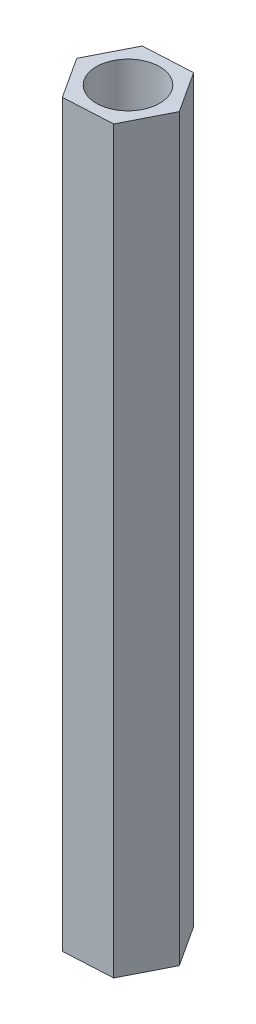
ISO-10303-21;
HEADER;
FILE_DESCRIPTION(('STEP AP214'),'2;1');
FILE_NAME('part.step','',(''),(''),'','','');
FILE_SCHEMA(('AUTOMOTIVE_DESIGN { 1 0 10303 214 1 1 1 1 }'));
ENDSEC;
DATA;
#1=APPLICATION_CONTEXT('core data for automotive mechanical design processes');
#2=APPLICATION_PROTOCOL_DEFINITION('international standard','automotive_design',2000,#1);
#3=PRODUCT_CONTEXT('',#1,'mechanical');
#4=PRODUCT('Part','Part','',(#3));
#5=PRODUCT_RELATED_PRODUCT_CATEGORY('part','',(#4));
#6=PRODUCT_DEFINITION_FORMATION('','',#4);
#7=PRODUCT_DEFINITION_CONTEXT('part definition',#1,'design');
#8=PRODUCT_DEFINITION('design','',#6,#7);
#9=PRODUCT_DEFINITION_SHAPE('','',#8);
#10=(LENGTH_UNIT() NAMED_UNIT(*) SI_UNIT(.MILLI.,.METRE.));
#11=(NAMED_UNIT(*) PLANE_ANGLE_UNIT() SI_UNIT($,.RADIAN.));
#12=(NAMED_UNIT(*) SI_UNIT($,.STERADIAN.) SOLID_ANGLE_UNIT());
#13=UNCERTAINTY_MEASURE_WITH_UNIT(LENGTH_MEASURE(1.E-05),#10,'distance_accuracy_value','');
#14=(GEOMETRIC_REPRESENTATION_CONTEXT(3) GLOBAL_UNCERTAINTY_ASSIGNED_CONTEXT((#13)) GLOBAL_UNIT_ASSIGNED_CONTEXT((#10,
#11,#12)) REPRESENTATION_CONTEXT('',''));
#15=CARTESIAN_POINT('',(0.,0.,0.));
#16=DIRECTION('',(0.,0.,1.));
#17=DIRECTION('',(1.,0.,0.));
#18=AXIS2_PLACEMENT_3D('',#15,#16,#17);
#19=CARTESIAN_POINT('',(0.,35.,0.));
#20=DIRECTION('',(0.,1.,0.));
#21=DIRECTION('',(0.,0.,1.));
#22=AXIS2_PLACEMENT_3D('',#19,#20,#21);
#23=PLANE('',#22);
#24=DIRECTION('',(-0.544928376691664,0.,-0.838482596287));
#25=VECTOR('',#24,1.);
#26=CARTESIAN_POINT('',(2.306194282518,35.,-0.121660448029098));
#27=LINE('',#26,#25);
#28=CARTESIAN_POINT('',(2.306194282518,35.,-0.121660448029098));
#29=VERTEX_POINT('',#28);
#30=CARTESIAN_POINT('',(1.04773610263,35.,-2.05805305873756));
#31=VERTEX_POINT('',#30);
#32=EDGE_CURVE('E131',#29,#31,#27,.T.);
#33=ORIENTED_EDGE('',*,*,#32,.T.);
#34=DIRECTION('',(-0.998611417361505,0.,0.0526805193144976));
#35=VECTOR('',#34,1.);
#36=CARTESIAN_POINT('',(1.04773610263,35.,-2.05805305873756));
#37=LINE('',#36,#35);
#38=CARTESIAN_POINT('',(-1.25845817988799,35.,-1.93639261070846));
#39=VERTEX_POINT('',#38);
#40=EDGE_CURVE('E89',#31,#39,#37,.T.);
#41=ORIENTED_EDGE('',*,*,#40,.T.);
#42=DIRECTION('',(-0.453683040669841,0.,0.891163115601497));
#43=VECTOR('',#42,1.);
#44=CARTESIAN_POINT('',(-1.25845817988799,35.,-1.93639261070846));
#45=LINE('',#44,#43);
#46=CARTESIAN_POINT('',(-2.30619428251799,35.,0.121660448029098));
#47=VERTEX_POINT('',#46);
#48=EDGE_CURVE('E102',#39,#47,#45,.T.);
#49=ORIENTED_EDGE('',*,*,#48,.T.);
#50=DIRECTION('',(0.544928376691665,0.,0.838482596286999));
#51=VECTOR('',#50,1.);
#52=CARTESIAN_POINT('',(-2.30619428251799,35.,0.121660448029098));
#53=LINE('',#52,#51);
#54=CARTESIAN_POINT('',(-1.04773610263,35.,2.05805305873756));
#55=VERTEX_POINT('',#54);
#56=EDGE_CURVE('E96',#47,#55,#53,.T.);
#57=ORIENTED_EDGE('',*,*,#56,.T.);
#58=DIRECTION('',(0.998611417361505,0.,-0.0526805193144977));
#59=VECTOR('',#58,1.);
#60=CARTESIAN_POINT('',(-1.04773610263,35.,2.05805305873756));
#61=LINE('',#60,#59);
#62=CARTESIAN_POINT('',(1.25845817988799,35.,1.93639261070846));
#63=VERTEX_POINT('',#62);
#64=EDGE_CURVE('E100',#55,#63,#61,.T.);
#65=ORIENTED_EDGE('',*,*,#64,.T.);
#66=DIRECTION('',(0.453683040669841,0.,-0.891163115601497));
#67=VECTOR('',#66,1.);
#68=CARTESIAN_POINT('',(1.25845817988799,35.,1.93639261070846));
#69=LINE('',#68,#67);
#70=EDGE_CURVE('E52',#63,#29,#69,.T.);
#71=ORIENTED_EDGE('',*,*,#70,.T.);
#72=EDGE_LOOP('',(#33,#41,#49,#57,#65,#71));
#73=FACE_BOUND('',#72,.T.);
#74=CARTESIAN_POINT('',(0.,35.,0.));
#75=DIRECTION('',(0.,1.,0.));
#76=DIRECTION('',(0.,0.,1.));
#77=AXIS2_PLACEMENT_3D('',#74,#75,#76);
#78=CIRCLE('',#77,1.5);
#79=CARTESIAN_POINT('',(0.,35.,1.5));
#80=VERTEX_POINT('',#79);
#81=EDGE_CURVE('E124',#80,#80,#78,.T.);
#82=ORIENTED_EDGE('',*,*,#81,.F.);
#83=EDGE_LOOP('',(#82));
#84=FACE_BOUND('',#83,.T.);
#85=ADVANCED_FACE('F35',(#73,#84),#23,.T.);
#86=CARTESIAN_POINT('',(0.,0.,0.));
#87=DIRECTION('',(0.,1.,0.));
#88=DIRECTION('',(0.,0.,1.));
#89=AXIS2_PLACEMENT_3D('',#86,#87,#88);
#90=PLANE('',#89);
#91=DIRECTION('',(-0.544928376691664,0.,-0.838482596287));
#92=VECTOR('',#91,1.);
#93=CARTESIAN_POINT('',(2.306194282518,0.,-0.121660448029098));
#94=LINE('',#93,#92);
#95=CARTESIAN_POINT('',(2.306194282518,0.,-0.121660448029098));
#96=VERTEX_POINT('',#95);
#97=CARTESIAN_POINT('',(1.04773610263,0.,-2.05805305873756));
#98=VERTEX_POINT('',#97);
#99=EDGE_CURVE('E120',#96,#98,#94,.T.);
#100=ORIENTED_EDGE('',*,*,#99,.F.);
#101=DIRECTION('',(0.453683040669841,0.,-0.891163115601497));
#102=VECTOR('',#101,1.);
#103=CARTESIAN_POINT('',(1.25845817988799,0.,1.93639261070846));
#104=LINE('',#103,#102);
#105=CARTESIAN_POINT('',(1.25845817988799,0.,1.93639261070846));
#106=VERTEX_POINT('',#105);
#107=EDGE_CURVE('E81',#106,#96,#104,.T.);
#108=ORIENTED_EDGE('',*,*,#107,.F.);
#109=DIRECTION('',(0.998611417361505,0.,-0.0526805193144977));
#110=VECTOR('',#109,1.);
#111=CARTESIAN_POINT('',(-1.04773610263,0.,2.05805305873756));
#112=LINE('',#111,#110);
#113=CARTESIAN_POINT('',(-1.04773610263,0.,2.05805305873756));
#114=VERTEX_POINT('',#113);
#115=EDGE_CURVE('E75',#114,#106,#112,.T.);
#116=ORIENTED_EDGE('',*,*,#115,.F.);
#117=DIRECTION('',(0.544928376691665,0.,0.838482596286999));
#118=VECTOR('',#117,1.);
#119=CARTESIAN_POINT('',(-2.30619428251799,0.,0.121660448029098));
#120=LINE('',#119,#118);
#121=CARTESIAN_POINT('',(-2.30619428251799,0.,0.121660448029098));
#122=VERTEX_POINT('',#121);
#123=EDGE_CURVE('E110',#122,#114,#120,.T.);
#124=ORIENTED_EDGE('',*,*,#123,.F.);
#125=DIRECTION('',(-0.453683040669841,0.,0.891163115601497));
#126=VECTOR('',#125,1.);
#127=CARTESIAN_POINT('',(-1.25845817988799,0.,-1.93639261070846));
#128=LINE('',#127,#126);
#129=CARTESIAN_POINT('',(-1.25845817988799,0.,-1.93639261070846));
#130=VERTEX_POINT('',#129);
#131=EDGE_CURVE('E126',#130,#122,#128,.T.);
#132=ORIENTED_EDGE('',*,*,#131,.F.);
#133=DIRECTION('',(-0.998611417361505,0.,0.0526805193144976));
#134=VECTOR('',#133,1.);
#135=CARTESIAN_POINT('',(1.04773610263,0.,-2.05805305873756));
#136=LINE('',#135,#134);
#137=EDGE_CURVE('E123',#98,#130,#136,.T.);
#138=ORIENTED_EDGE('',*,*,#137,.F.);
#139=EDGE_LOOP('',(#100,#108,#116,#124,#132,#138));
#140=FACE_BOUND('',#139,.T.);
#141=CARTESIAN_POINT('',(0.,0.,0.));
#142=DIRECTION('',(0.,1.,0.));
#143=DIRECTION('',(0.,0.,1.));
#144=AXIS2_PLACEMENT_3D('',#141,#142,#143);
#145=CIRCLE('',#144,1.5);
#146=CARTESIAN_POINT('',(0.,0.,1.5));
#147=VERTEX_POINT('',#146);
#148=EDGE_CURVE('E224',#147,#147,#145,.T.);
#149=ORIENTED_EDGE('',*,*,#148,.T.);
#150=EDGE_LOOP('',(#149));
#151=FACE_BOUND('',#150,.T.);
#152=ADVANCED_FACE('F140',(#140,#151),#90,.F.);
#153=CARTESIAN_POINT('',(2.306194282518,35.,-0.121660448029098));
#154=DIRECTION('',(-0.838482596287,0.,0.544928376691664));
#155=DIRECTION('',(0.544928376691664,0.,0.838482596287));
#156=AXIS2_PLACEMENT_3D('',#153,#154,#155);
#157=PLANE('',#156);
#158=ORIENTED_EDGE('',*,*,#99,.T.);
#159=DIRECTION('',(0.,-1.,0.));
#160=VECTOR('',#159,1.);
#161=CARTESIAN_POINT('',(1.04773610263,35.,-2.05805305873756));
#162=LINE('',#161,#160);
#163=EDGE_CURVE('E11',#31,#98,#162,.T.);
#164=ORIENTED_EDGE('',*,*,#163,.F.);
#165=ORIENTED_EDGE('',*,*,#32,.F.);
#166=DIRECTION('',(0.,-1.,0.));
#167=VECTOR('',#166,1.);
#168=CARTESIAN_POINT('',(2.306194282518,35.,-0.121660448029098));
#169=LINE('',#168,#167);
#170=EDGE_CURVE('E116',#29,#96,#169,.T.);
#171=ORIENTED_EDGE('',*,*,#170,.T.);
#172=EDGE_LOOP('',(#158,#164,#165,#171));
#173=FACE_BOUND('',#172,.T.);
#174=ADVANCED_FACE('F37',(#173),#157,.F.);
#175=CARTESIAN_POINT('',(1.04773610263,35.,-2.05805305873756));
#176=DIRECTION('',(0.0526805193144976,0.,0.998611417361505));
#177=DIRECTION('',(0.998611417361505,0.,-0.0526805193144976));
#178=AXIS2_PLACEMENT_3D('',#175,#176,#177);
#179=PLANE('',#178);
#180=ORIENTED_EDGE('',*,*,#137,.T.);
#181=DIRECTION('',(0.,-1.,0.));
#182=VECTOR('',#181,1.);
#183=CARTESIAN_POINT('',(-1.25845817988799,35.,-1.93639261070846));
#184=LINE('',#183,#182);
#185=EDGE_CURVE('E44',#39,#130,#184,.T.);
#186=ORIENTED_EDGE('',*,*,#185,.F.);
#187=ORIENTED_EDGE('',*,*,#40,.F.);
#188=ORIENTED_EDGE('',*,*,#163,.T.);
#189=EDGE_LOOP('',(#180,#186,#187,#188));
#190=FACE_BOUND('',#189,.T.);
#191=ADVANCED_FACE('F165',(#190),#179,.F.);
#192=CARTESIAN_POINT('',(-1.25845817988799,35.,-1.93639261070846));
#193=DIRECTION('',(0.891163115601497,0.,0.453683040669841));
#194=DIRECTION('',(0.453683040669841,0.,-0.891163115601497));
#195=AXIS2_PLACEMENT_3D('',#192,#193,#194);
#196=PLANE('',#195);
#197=ORIENTED_EDGE('',*,*,#131,.T.);
#198=DIRECTION('',(0.,-1.,0.));
#199=VECTOR('',#198,1.);
#200=CARTESIAN_POINT('',(-2.30619428251799,35.,0.121660448029098));
#201=LINE('',#200,#199);
#202=EDGE_CURVE('E111',#47,#122,#201,.T.);
#203=ORIENTED_EDGE('',*,*,#202,.F.);
#204=ORIENTED_EDGE('',*,*,#48,.F.);
#205=ORIENTED_EDGE('',*,*,#185,.T.);
#206=EDGE_LOOP('',(#197,#203,#204,#205));
#207=FACE_BOUND('',#206,.T.);
#208=ADVANCED_FACE('F137',(#207),#196,.F.);
#209=CARTESIAN_POINT('',(-2.30619428251799,35.,0.121660448029098));
#210=DIRECTION('',(0.838482596286999,0.,-0.544928376691665));
#211=DIRECTION('',(-0.544928376691665,0.,-0.838482596287));
#212=AXIS2_PLACEMENT_3D('',#209,#210,#211);
#213=PLANE('',#212);
#214=ORIENTED_EDGE('',*,*,#123,.T.);
#215=DIRECTION('',(0.,-1.,0.));
#216=VECTOR('',#215,1.);
#217=CARTESIAN_POINT('',(-1.04773610263,35.,2.05805305873756));
#218=LINE('',#217,#216);
#219=EDGE_CURVE('E107',#55,#114,#218,.T.);
#220=ORIENTED_EDGE('',*,*,#219,.F.);
#221=ORIENTED_EDGE('',*,*,#56,.F.);
#222=ORIENTED_EDGE('',*,*,#202,.T.);
#223=EDGE_LOOP('',(#214,#220,#221,#222));
#224=FACE_BOUND('',#223,.T.);
#225=ADVANCED_FACE('F108',(#224),#213,.F.);
#226=CARTESIAN_POINT('',(-1.04773610263,35.,2.05805305873756));
#227=DIRECTION('',(-0.0526805193144977,0.,-0.998611417361505));
#228=DIRECTION('',(-0.998611417361505,0.,0.0526805193144977));
#229=AXIS2_PLACEMENT_3D('',#226,#227,#228);
#230=PLANE('',#229);
#231=ORIENTED_EDGE('',*,*,#115,.T.);
#232=DIRECTION('',(0.,-1.,0.));
#233=VECTOR('',#232,1.);
#234=CARTESIAN_POINT('',(1.25845817988799,35.,1.93639261070846));
#235=LINE('',#234,#233);
#236=EDGE_CURVE('E112',#63,#106,#235,.T.);
#237=ORIENTED_EDGE('',*,*,#236,.F.);
#238=ORIENTED_EDGE('',*,*,#64,.F.);
#239=ORIENTED_EDGE('',*,*,#219,.T.);
#240=EDGE_LOOP('',(#231,#237,#238,#239));
#241=FACE_BOUND('',#240,.T.);
#242=ADVANCED_FACE('F114',(#241),#230,.F.);
#243=CARTESIAN_POINT('',(1.25845817988799,35.,1.93639261070846));
#244=DIRECTION('',(-0.891163115601497,0.,-0.453683040669841));
#245=DIRECTION('',(-0.453683040669841,0.,0.891163115601497));
#246=AXIS2_PLACEMENT_3D('',#243,#244,#245);
#247=PLANE('',#246);
#248=ORIENTED_EDGE('',*,*,#107,.T.);
#249=ORIENTED_EDGE('',*,*,#170,.F.);
#250=ORIENTED_EDGE('',*,*,#70,.F.);
#251=ORIENTED_EDGE('',*,*,#236,.T.);
#252=EDGE_LOOP('',(#248,#249,#250,#251));
#253=FACE_BOUND('',#252,.T.);
#254=ADVANCED_FACE('F145',(#253),#247,.F.);
#255=CARTESIAN_POINT('',(0.,35.,0.));
#256=DIRECTION('',(0.,-1.,0.));
#257=DIRECTION('',(0.,0.,-1.));
#258=AXIS2_PLACEMENT_3D('',#255,#256,#257);
#259=CYLINDRICAL_SURFACE('',#258,1.5);
#260=ORIENTED_EDGE('',*,*,#81,.T.);
#261=EDGE_LOOP('',(#260));
#262=FACE_BOUND('',#261,.T.);
#263=ORIENTED_EDGE('',*,*,#148,.F.);
#264=EDGE_LOOP('',(#263));
#265=FACE_BOUND('',#264,.T.);
#266=ADVANCED_FACE('F147',(#262,#265),#259,.F.);
#267=CLOSED_SHELL('',(#85,#152,#174,#191,#208,#225,#242,#254,#266));
#268=MANIFOLD_SOLID_BREP('B2',#267);
#269=ADVANCED_BREP_SHAPE_REPRESENTATION('',(#18,#268),#14);
#270=SHAPE_DEFINITION_REPRESENTATION(#9,#269);
ENDSEC;
END-ISO-10303-21;
